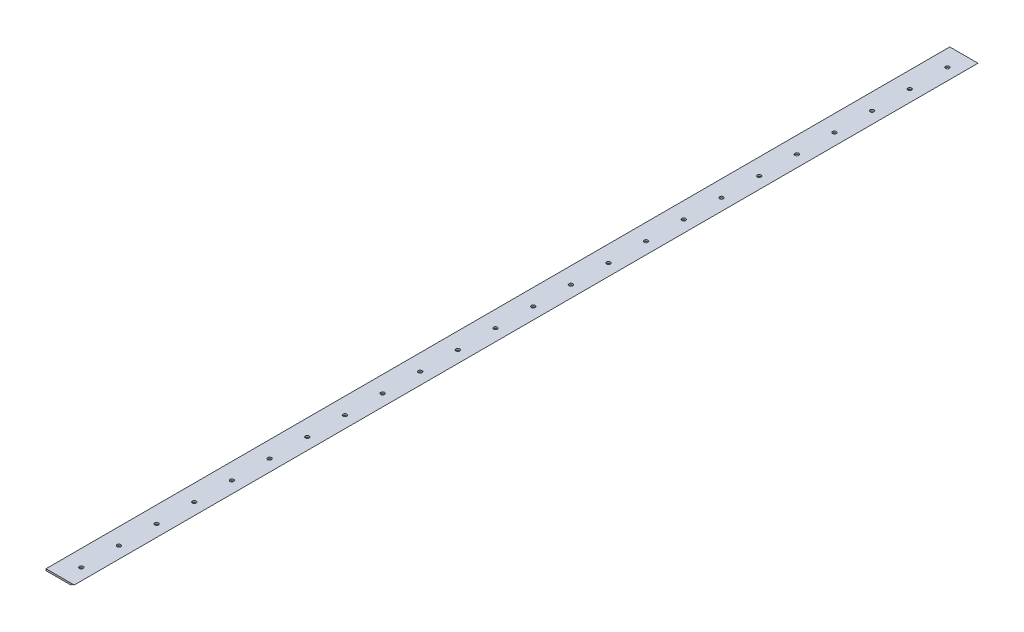
ISO-10303-21;
HEADER;
FILE_DESCRIPTION(('STEP AP214'),'2;1');
FILE_NAME('part.step','',(''),(''),'','','');
FILE_SCHEMA(('AUTOMOTIVE_DESIGN { 1 0 10303 214 1 1 1 1 }'));
ENDSEC;
DATA;
#1=APPLICATION_CONTEXT('core data for automotive mechanical design processes');
#2=APPLICATION_PROTOCOL_DEFINITION('international standard','automotive_design',2000,#1);
#3=PRODUCT_CONTEXT('',#1,'mechanical');
#4=PRODUCT('Part','Part','',(#3));
#5=PRODUCT_RELATED_PRODUCT_CATEGORY('part','',(#4));
#6=PRODUCT_DEFINITION_FORMATION('','',#4);
#7=PRODUCT_DEFINITION_CONTEXT('part definition',#1,'design');
#8=PRODUCT_DEFINITION('design','',#6,#7);
#9=PRODUCT_DEFINITION_SHAPE('','',#8);
#10=(LENGTH_UNIT() NAMED_UNIT(*) SI_UNIT(.MILLI.,.METRE.));
#11=(NAMED_UNIT(*) PLANE_ANGLE_UNIT() SI_UNIT($,.RADIAN.));
#12=(NAMED_UNIT(*) SI_UNIT($,.STERADIAN.) SOLID_ANGLE_UNIT());
#13=UNCERTAINTY_MEASURE_WITH_UNIT(LENGTH_MEASURE(1.E-05),#10,'distance_accuracy_value','');
#14=(GEOMETRIC_REPRESENTATION_CONTEXT(3) GLOBAL_UNCERTAINTY_ASSIGNED_CONTEXT((#13)) GLOBAL_UNIT_ASSIGNED_CONTEXT((#10,
#11,#12)) REPRESENTATION_CONTEXT('',''));
#15=CARTESIAN_POINT('',(0.,0.,0.));
#16=DIRECTION('',(0.,0.,1.));
#17=DIRECTION('',(1.,0.,0.));
#18=AXIS2_PLACEMENT_3D('',#15,#16,#17);
#19=CARTESIAN_POINT('',(0.,5.461,609.6));
#20=DIRECTION('',(0.,0.,-1.));
#21=DIRECTION('',(-1.,0.,0.));
#22=AXIS2_PLACEMENT_3D('',#19,#20,#21);
#23=CYLINDRICAL_SURFACE('',#22,5.461);
#24=CARTESIAN_POINT('',(0.,5.461,-609.6));
#25=DIRECTION('',(0.,0.,1.));
#26=DIRECTION('',(1.,0.,0.));
#27=AXIS2_PLACEMENT_3D('',#24,#25,#26);
#28=CIRCLE('',#27,5.461);
#29=CARTESIAN_POINT('',(0.,10.922,-609.6));
#30=VERTEX_POINT('',#29);
#31=CARTESIAN_POINT('',(-4.44318534387212,8.636,-609.6));
#32=VERTEX_POINT('',#31);
#33=EDGE_CURVE('E103',#30,#32,#28,.T.);
#34=ORIENTED_EDGE('',*,*,#33,.F.);
#35=DIRECTION('',(0.,0.,-1.));
#36=VECTOR('',#35,1.);
#37=CARTESIAN_POINT('',(0.,10.922,609.6));
#38=LINE('',#37,#36);
#39=CARTESIAN_POINT('',(0.,10.922,609.6));
#40=VERTEX_POINT('',#39);
#41=EDGE_CURVE('E74',#40,#30,#38,.T.);
#42=ORIENTED_EDGE('',*,*,#41,.F.);
#43=CARTESIAN_POINT('',(0.,5.461,609.6));
#44=DIRECTION('',(0.,0.,1.));
#45=DIRECTION('',(1.,0.,0.));
#46=AXIS2_PLACEMENT_3D('',#43,#44,#45);
#47=CIRCLE('',#46,5.461);
#48=CARTESIAN_POINT('',(-4.44318534387212,8.636,609.6));
#49=VERTEX_POINT('',#48);
#50=EDGE_CURVE('E85',#40,#49,#47,.T.);
#51=ORIENTED_EDGE('',*,*,#50,.T.);
#52=DIRECTION('',(0.,0.,-1.));
#53=VECTOR('',#52,1.);
#54=CARTESIAN_POINT('',(-4.44318534387212,8.636,609.6));
#55=LINE('',#54,#53);
#56=EDGE_CURVE('E51',#49,#32,#55,.T.);
#57=ORIENTED_EDGE('',*,*,#56,.T.);
#58=EDGE_LOOP('',(#34,#42,#51,#57));
#59=FACE_BOUND('',#58,.T.);
#60=ADVANCED_FACE('F34',(#59),#23,.F.);
#61=CARTESIAN_POINT('',(0.,10.922,609.6));
#62=DIRECTION('',(0.,-1.,0.));
#63=DIRECTION('',(1.,0.,0.));
#64=AXIS2_PLACEMENT_3D('',#61,#62,#63);
#65=PLANE('',#64);
#66=CARTESIAN_POINT('',(-15.875,10.922,533.4));
#67=DIRECTION('',(0.,1.,0.));
#68=DIRECTION('',(0.,0.,1.));
#69=AXIS2_PLACEMENT_3D('',#66,#67,#68);
#70=CIRCLE('',#69,2.55269999999999);
#71=CARTESIAN_POINT('',(-15.875,10.922,535.9527));
#72=VERTEX_POINT('',#71);
#73=EDGE_CURVE('E377',#72,#72,#70,.T.);
#74=ORIENTED_EDGE('',*,*,#73,.F.);
#75=EDGE_LOOP('',(#74));
#76=FACE_BOUND('',#75,.T.);
#77=CARTESIAN_POINT('',(-15.875,10.922,584.2));
#78=DIRECTION('',(0.,1.,0.));
#79=DIRECTION('',(0.,0.,1.));
#80=AXIS2_PLACEMENT_3D('',#77,#78,#79);
#81=CIRCLE('',#80,2.55269999999999);
#82=CARTESIAN_POINT('',(-15.875,10.922,586.7527));
#83=VERTEX_POINT('',#82);
#84=EDGE_CURVE('E378',#83,#83,#81,.T.);
#85=ORIENTED_EDGE('',*,*,#84,.F.);
#86=EDGE_LOOP('',(#85));
#87=FACE_BOUND('',#86,.T.);
#88=DIRECTION('',(-1.,0.,0.));
#89=VECTOR('',#88,1.);
#90=CARTESIAN_POINT('',(0.,10.922,-609.6));
#91=LINE('',#90,#89);
#92=CARTESIAN_POINT('',(-38.1,10.922,-609.6));
#93=VERTEX_POINT('',#92);
#94=EDGE_CURVE('E93',#30,#93,#91,.T.);
#95=ORIENTED_EDGE('',*,*,#94,.T.);
#96=DIRECTION('',(0.,0.,-1.));
#97=VECTOR('',#96,1.);
#98=CARTESIAN_POINT('',(-38.1,10.922,609.6));
#99=LINE('',#98,#97);
#100=CARTESIAN_POINT('',(-38.1,10.922,609.6));
#101=VERTEX_POINT('',#100);
#102=EDGE_CURVE('E89',#101,#93,#99,.T.);
#103=ORIENTED_EDGE('',*,*,#102,.F.);
#104=DIRECTION('',(-1.,0.,0.));
#105=VECTOR('',#104,1.);
#106=CARTESIAN_POINT('',(0.,10.922,609.6));
#107=LINE('',#106,#105);
#108=EDGE_CURVE('E79',#40,#101,#107,.T.);
#109=ORIENTED_EDGE('',*,*,#108,.F.);
#110=ORIENTED_EDGE('',*,*,#41,.T.);
#111=EDGE_LOOP('',(#95,#103,#109,#110));
#112=FACE_BOUND('',#111,.T.);
#113=CARTESIAN_POINT('',(-15.875,10.922,482.6));
#114=DIRECTION('',(0.,1.,0.));
#115=DIRECTION('',(0.,0.,1.));
#116=AXIS2_PLACEMENT_3D('',#113,#114,#115);
#117=CIRCLE('',#116,2.55269999999999);
#118=CARTESIAN_POINT('',(-15.875,10.922,485.1527));
#119=VERTEX_POINT('',#118);
#120=EDGE_CURVE('E118',#119,#119,#117,.T.);
#121=ORIENTED_EDGE('',*,*,#120,.F.);
#122=EDGE_LOOP('',(#121));
#123=FACE_BOUND('',#122,.T.);
#124=CARTESIAN_POINT('',(-15.875,10.922,431.8));
#125=DIRECTION('',(0.,1.,0.));
#126=DIRECTION('',(0.,0.,1.));
#127=AXIS2_PLACEMENT_3D('',#124,#125,#126);
#128=CIRCLE('',#127,2.55269999999999);
#129=CARTESIAN_POINT('',(-15.875,10.922,434.3527));
#130=VERTEX_POINT('',#129);
#131=EDGE_CURVE('E124',#130,#130,#128,.T.);
#132=ORIENTED_EDGE('',*,*,#131,.F.);
#133=EDGE_LOOP('',(#132));
#134=FACE_BOUND('',#133,.T.);
#135=CARTESIAN_POINT('',(-15.875,10.922,381.));
#136=DIRECTION('',(0.,1.,0.));
#137=DIRECTION('',(0.,0.,1.));
#138=AXIS2_PLACEMENT_3D('',#135,#136,#137);
#139=CIRCLE('',#138,2.55269999999999);
#140=CARTESIAN_POINT('',(-15.875,10.922,383.5527));
#141=VERTEX_POINT('',#140);
#142=EDGE_CURVE('E130',#141,#141,#139,.T.);
#143=ORIENTED_EDGE('',*,*,#142,.F.);
#144=EDGE_LOOP('',(#143));
#145=FACE_BOUND('',#144,.T.);
#146=CARTESIAN_POINT('',(-15.875,10.922,330.2));
#147=DIRECTION('',(0.,1.,0.));
#148=DIRECTION('',(0.,0.,1.));
#149=AXIS2_PLACEMENT_3D('',#146,#147,#148);
#150=CIRCLE('',#149,2.55269999999999);
#151=CARTESIAN_POINT('',(-15.875,10.922,332.7527));
#152=VERTEX_POINT('',#151);
#153=EDGE_CURVE('E136',#152,#152,#150,.T.);
#154=ORIENTED_EDGE('',*,*,#153,.F.);
#155=EDGE_LOOP('',(#154));
#156=FACE_BOUND('',#155,.T.);
#157=CARTESIAN_POINT('',(-15.875,10.922,279.4));
#158=DIRECTION('',(0.,1.,0.));
#159=DIRECTION('',(0.,0.,1.));
#160=AXIS2_PLACEMENT_3D('',#157,#158,#159);
#161=CIRCLE('',#160,2.55269999999999);
#162=CARTESIAN_POINT('',(-15.875,10.922,281.9527));
#163=VERTEX_POINT('',#162);
#164=EDGE_CURVE('E142',#163,#163,#161,.T.);
#165=ORIENTED_EDGE('',*,*,#164,.F.);
#166=EDGE_LOOP('',(#165));
#167=FACE_BOUND('',#166,.T.);
#168=CARTESIAN_POINT('',(-15.875,10.922,228.6));
#169=DIRECTION('',(0.,1.,0.));
#170=DIRECTION('',(0.,0.,1.));
#171=AXIS2_PLACEMENT_3D('',#168,#169,#170);
#172=CIRCLE('',#171,2.55269999999999);
#173=CARTESIAN_POINT('',(-15.875,10.922,231.1527));
#174=VERTEX_POINT('',#173);
#175=EDGE_CURVE('E148',#174,#174,#172,.T.);
#176=ORIENTED_EDGE('',*,*,#175,.F.);
#177=EDGE_LOOP('',(#176));
#178=FACE_BOUND('',#177,.T.);
#179=CARTESIAN_POINT('',(-15.875,10.922,177.8));
#180=DIRECTION('',(0.,1.,0.));
#181=DIRECTION('',(0.,0.,1.));
#182=AXIS2_PLACEMENT_3D('',#179,#180,#181);
#183=CIRCLE('',#182,2.55269999999999);
#184=CARTESIAN_POINT('',(-15.875,10.922,180.3527));
#185=VERTEX_POINT('',#184);
#186=EDGE_CURVE('E154',#185,#185,#183,.T.);
#187=ORIENTED_EDGE('',*,*,#186,.F.);
#188=EDGE_LOOP('',(#187));
#189=FACE_BOUND('',#188,.T.);
#190=CARTESIAN_POINT('',(-15.875,10.922,127.));
#191=DIRECTION('',(0.,1.,0.));
#192=DIRECTION('',(0.,0.,1.));
#193=AXIS2_PLACEMENT_3D('',#190,#191,#192);
#194=CIRCLE('',#193,2.55269999999999);
#195=CARTESIAN_POINT('',(-15.875,10.922,129.5527));
#196=VERTEX_POINT('',#195);
#197=EDGE_CURVE('E160',#196,#196,#194,.T.);
#198=ORIENTED_EDGE('',*,*,#197,.F.);
#199=EDGE_LOOP('',(#198));
#200=FACE_BOUND('',#199,.T.);
#201=CARTESIAN_POINT('',(-15.875,10.922,76.2000000000001));
#202=DIRECTION('',(0.,1.,0.));
#203=DIRECTION('',(0.,0.,1.));
#204=AXIS2_PLACEMENT_3D('',#201,#202,#203);
#205=CIRCLE('',#204,2.55269999999999);
#206=CARTESIAN_POINT('',(-15.875,10.922,78.7527000000001));
#207=VERTEX_POINT('',#206);
#208=EDGE_CURVE('E166',#207,#207,#205,.T.);
#209=ORIENTED_EDGE('',*,*,#208,.F.);
#210=EDGE_LOOP('',(#209));
#211=FACE_BOUND('',#210,.T.);
#212=CARTESIAN_POINT('',(-15.875,10.922,25.4000000000001));
#213=DIRECTION('',(0.,1.,0.));
#214=DIRECTION('',(0.,0.,1.));
#215=AXIS2_PLACEMENT_3D('',#212,#213,#214);
#216=CIRCLE('',#215,2.55269999999999);
#217=CARTESIAN_POINT('',(-15.875,10.922,27.9527000000001));
#218=VERTEX_POINT('',#217);
#219=EDGE_CURVE('E172',#218,#218,#216,.T.);
#220=ORIENTED_EDGE('',*,*,#219,.F.);
#221=EDGE_LOOP('',(#220));
#222=FACE_BOUND('',#221,.T.);
#223=CARTESIAN_POINT('',(-15.875,10.922,-25.3999999999999));
#224=DIRECTION('',(0.,1.,0.));
#225=DIRECTION('',(0.,0.,1.));
#226=AXIS2_PLACEMENT_3D('',#223,#224,#225);
#227=CIRCLE('',#226,2.55269999999999);
#228=CARTESIAN_POINT('',(-15.875,10.922,-22.8472999999999));
#229=VERTEX_POINT('',#228);
#230=EDGE_CURVE('E178',#229,#229,#227,.T.);
#231=ORIENTED_EDGE('',*,*,#230,.F.);
#232=EDGE_LOOP('',(#231));
#233=FACE_BOUND('',#232,.T.);
#234=CARTESIAN_POINT('',(-15.875,10.922,-76.1999999999999));
#235=DIRECTION('',(0.,1.,0.));
#236=DIRECTION('',(0.,0.,1.));
#237=AXIS2_PLACEMENT_3D('',#234,#235,#236);
#238=CIRCLE('',#237,2.55269999999999);
#239=CARTESIAN_POINT('',(-15.875,10.922,-73.6472999999999));
#240=VERTEX_POINT('',#239);
#241=EDGE_CURVE('E184',#240,#240,#238,.T.);
#242=ORIENTED_EDGE('',*,*,#241,.F.);
#243=EDGE_LOOP('',(#242));
#244=FACE_BOUND('',#243,.T.);
#245=CARTESIAN_POINT('',(-15.875,10.922,-127.));
#246=DIRECTION('',(0.,1.,0.));
#247=DIRECTION('',(0.,0.,1.));
#248=AXIS2_PLACEMENT_3D('',#245,#246,#247);
#249=CIRCLE('',#248,2.55269999999999);
#250=CARTESIAN_POINT('',(-15.875,10.922,-124.4473));
#251=VERTEX_POINT('',#250);
#252=EDGE_CURVE('E190',#251,#251,#249,.T.);
#253=ORIENTED_EDGE('',*,*,#252,.F.);
#254=EDGE_LOOP('',(#253));
#255=FACE_BOUND('',#254,.T.);
#256=CARTESIAN_POINT('',(-15.875,10.922,-177.8));
#257=DIRECTION('',(0.,1.,0.));
#258=DIRECTION('',(0.,0.,1.));
#259=AXIS2_PLACEMENT_3D('',#256,#257,#258);
#260=CIRCLE('',#259,2.55269999999999);
#261=CARTESIAN_POINT('',(-15.875,10.922,-175.2473));
#262=VERTEX_POINT('',#261);
#263=EDGE_CURVE('E196',#262,#262,#260,.T.);
#264=ORIENTED_EDGE('',*,*,#263,.F.);
#265=EDGE_LOOP('',(#264));
#266=FACE_BOUND('',#265,.T.);
#267=CARTESIAN_POINT('',(-15.875,10.922,-228.6));
#268=DIRECTION('',(0.,1.,0.));
#269=DIRECTION('',(0.,0.,1.));
#270=AXIS2_PLACEMENT_3D('',#267,#268,#269);
#271=CIRCLE('',#270,2.55269999999999);
#272=CARTESIAN_POINT('',(-15.875,10.922,-226.0473));
#273=VERTEX_POINT('',#272);
#274=EDGE_CURVE('E202',#273,#273,#271,.T.);
#275=ORIENTED_EDGE('',*,*,#274,.F.);
#276=EDGE_LOOP('',(#275));
#277=FACE_BOUND('',#276,.T.);
#278=CARTESIAN_POINT('',(-15.875,10.922,-279.4));
#279=DIRECTION('',(0.,1.,0.));
#280=DIRECTION('',(0.,0.,1.));
#281=AXIS2_PLACEMENT_3D('',#278,#279,#280);
#282=CIRCLE('',#281,2.55269999999999);
#283=CARTESIAN_POINT('',(-15.875,10.922,-276.8473));
#284=VERTEX_POINT('',#283);
#285=EDGE_CURVE('E208',#284,#284,#282,.T.);
#286=ORIENTED_EDGE('',*,*,#285,.F.);
#287=EDGE_LOOP('',(#286));
#288=FACE_BOUND('',#287,.T.);
#289=CARTESIAN_POINT('',(-15.875,10.922,-330.2));
#290=DIRECTION('',(0.,1.,0.));
#291=DIRECTION('',(0.,0.,1.));
#292=AXIS2_PLACEMENT_3D('',#289,#290,#291);
#293=CIRCLE('',#292,2.55269999999999);
#294=CARTESIAN_POINT('',(-15.875,10.922,-327.6473));
#295=VERTEX_POINT('',#294);
#296=EDGE_CURVE('E214',#295,#295,#293,.T.);
#297=ORIENTED_EDGE('',*,*,#296,.F.);
#298=EDGE_LOOP('',(#297));
#299=FACE_BOUND('',#298,.T.);
#300=CARTESIAN_POINT('',(-15.875,10.922,-381.));
#301=DIRECTION('',(0.,1.,0.));
#302=DIRECTION('',(0.,0.,1.));
#303=AXIS2_PLACEMENT_3D('',#300,#301,#302);
#304=CIRCLE('',#303,2.55269999999999);
#305=CARTESIAN_POINT('',(-15.875,10.922,-378.4473));
#306=VERTEX_POINT('',#305);
#307=EDGE_CURVE('E220',#306,#306,#304,.T.);
#308=ORIENTED_EDGE('',*,*,#307,.F.);
#309=EDGE_LOOP('',(#308));
#310=FACE_BOUND('',#309,.T.);
#311=CARTESIAN_POINT('',(-15.875,10.922,-431.8));
#312=DIRECTION('',(0.,1.,0.));
#313=DIRECTION('',(0.,0.,1.));
#314=AXIS2_PLACEMENT_3D('',#311,#312,#313);
#315=CIRCLE('',#314,2.55269999999999);
#316=CARTESIAN_POINT('',(-15.875,10.922,-429.2473));
#317=VERTEX_POINT('',#316);
#318=EDGE_CURVE('E226',#317,#317,#315,.T.);
#319=ORIENTED_EDGE('',*,*,#318,.F.);
#320=EDGE_LOOP('',(#319));
#321=FACE_BOUND('',#320,.T.);
#322=CARTESIAN_POINT('',(-15.875,10.922,-482.6));
#323=DIRECTION('',(0.,1.,0.));
#324=DIRECTION('',(0.,0.,1.));
#325=AXIS2_PLACEMENT_3D('',#322,#323,#324);
#326=CIRCLE('',#325,2.55269999999999);
#327=CARTESIAN_POINT('',(-15.875,10.922,-480.0473));
#328=VERTEX_POINT('',#327);
#329=EDGE_CURVE('E232',#328,#328,#326,.T.);
#330=ORIENTED_EDGE('',*,*,#329,.F.);
#331=EDGE_LOOP('',(#330));
#332=FACE_BOUND('',#331,.T.);
#333=CARTESIAN_POINT('',(-15.875,10.922,-533.4));
#334=DIRECTION('',(0.,1.,0.));
#335=DIRECTION('',(0.,0.,1.));
#336=AXIS2_PLACEMENT_3D('',#333,#334,#335);
#337=CIRCLE('',#336,2.55269999999999);
#338=CARTESIAN_POINT('',(-15.875,10.922,-530.8473));
#339=VERTEX_POINT('',#338);
#340=EDGE_CURVE('E238',#339,#339,#337,.T.);
#341=ORIENTED_EDGE('',*,*,#340,.F.);
#342=EDGE_LOOP('',(#341));
#343=FACE_BOUND('',#342,.T.);
#344=CARTESIAN_POINT('',(-15.875,10.922,-584.2));
#345=DIRECTION('',(0.,1.,0.));
#346=DIRECTION('',(0.,0.,1.));
#347=AXIS2_PLACEMENT_3D('',#344,#345,#346);
#348=CIRCLE('',#347,2.55269999999999);
#349=CARTESIAN_POINT('',(-15.875,10.922,-581.6473));
#350=VERTEX_POINT('',#349);
#351=EDGE_CURVE('E11',#350,#350,#348,.T.);
#352=ORIENTED_EDGE('',*,*,#351,.F.);
#353=EDGE_LOOP('',(#352));
#354=FACE_BOUND('',#353,.T.);
#355=ADVANCED_FACE('F90',(#76,#87,#112,#123,#134,#145,#156,#167,#178,#189,#200,#211,#222,#233,
#244,#255,#266,#277,#288,#299,#310,#321,#332,#343,#354),#65,.F.);
#356=CARTESIAN_POINT('',(-38.1,0.,609.6));
#357=DIRECTION('',(1.,0.,0.));
#358=DIRECTION('',(0.,0.,-1.));
#359=AXIS2_PLACEMENT_3D('',#356,#357,#358);
#360=PLANE('',#359);
#361=DIRECTION('',(0.,-1.,0.));
#362=VECTOR('',#361,1.);
#363=CARTESIAN_POINT('',(-38.1,0.,-609.6));
#364=LINE('',#363,#362);
#365=CARTESIAN_POINT('',(-38.1,8.63599999999999,-609.6));
#366=VERTEX_POINT('',#365);
#367=EDGE_CURVE('E107',#93,#366,#364,.T.);
#368=ORIENTED_EDGE('',*,*,#367,.T.);
#369=DIRECTION('',(0.,0.,-1.));
#370=VECTOR('',#369,1.);
#371=CARTESIAN_POINT('',(-38.1,8.63599999999999,609.6));
#372=LINE('',#371,#370);
#373=CARTESIAN_POINT('',(-38.1,8.63599999999999,609.6));
#374=VERTEX_POINT('',#373);
#375=EDGE_CURVE('E66',#374,#366,#372,.T.);
#376=ORIENTED_EDGE('',*,*,#375,.F.);
#377=DIRECTION('',(0.,-1.,0.));
#378=VECTOR('',#377,1.);
#379=CARTESIAN_POINT('',(-38.1,0.,609.6));
#380=LINE('',#379,#378);
#381=EDGE_CURVE('E84',#101,#374,#380,.T.);
#382=ORIENTED_EDGE('',*,*,#381,.F.);
#383=ORIENTED_EDGE('',*,*,#102,.T.);
#384=EDGE_LOOP('',(#368,#376,#382,#383));
#385=FACE_BOUND('',#384,.T.);
#386=ADVANCED_FACE('F97',(#385),#360,.F.);
#387=CARTESIAN_POINT('',(0.,8.636,609.6));
#388=DIRECTION('',(0.,-1.,0.));
#389=DIRECTION('',(1.,0.,0.));
#390=AXIS2_PLACEMENT_3D('',#387,#388,#389);
#391=PLANE('',#390);
#392=CARTESIAN_POINT('',(-15.875,8.636,533.4));
#393=DIRECTION('',(0.,1.,0.));
#394=DIRECTION('',(0.,0.,1.));
#395=AXIS2_PLACEMENT_3D('',#392,#393,#394);
#396=CIRCLE('',#395,2.5527);
#397=CARTESIAN_POINT('',(-15.875,8.636,535.9527));
#398=VERTEX_POINT('',#397);
#399=EDGE_CURVE('E375',#398,#398,#396,.T.);
#400=ORIENTED_EDGE('',*,*,#399,.T.);
#401=EDGE_LOOP('',(#400));
#402=FACE_BOUND('',#401,.T.);
#403=CARTESIAN_POINT('',(-15.875,8.636,584.2));
#404=DIRECTION('',(0.,1.,0.));
#405=DIRECTION('',(0.,0.,1.));
#406=AXIS2_PLACEMENT_3D('',#403,#404,#405);
#407=CIRCLE('',#406,2.5527);
#408=CARTESIAN_POINT('',(-15.875,8.636,586.7527));
#409=VERTEX_POINT('',#408);
#410=EDGE_CURVE('E105',#409,#409,#407,.T.);
#411=ORIENTED_EDGE('',*,*,#410,.T.);
#412=EDGE_LOOP('',(#411));
#413=FACE_BOUND('',#412,.T.);
#414=DIRECTION('',(-1.,0.,0.));
#415=VECTOR('',#414,1.);
#416=CARTESIAN_POINT('',(0.,8.636,-609.6));
#417=LINE('',#416,#415);
#418=EDGE_CURVE('E109',#32,#366,#417,.T.);
#419=ORIENTED_EDGE('',*,*,#418,.F.);
#420=ORIENTED_EDGE('',*,*,#56,.F.);
#421=DIRECTION('',(-1.,0.,0.));
#422=VECTOR('',#421,1.);
#423=CARTESIAN_POINT('',(0.,8.636,609.6));
#424=LINE('',#423,#422);
#425=EDGE_CURVE('E98',#49,#374,#424,.T.);
#426=ORIENTED_EDGE('',*,*,#425,.T.);
#427=ORIENTED_EDGE('',*,*,#375,.T.);
#428=EDGE_LOOP('',(#419,#420,#426,#427));
#429=FACE_BOUND('',#428,.T.);
#430=CARTESIAN_POINT('',(-15.875,8.636,482.6));
#431=DIRECTION('',(0.,1.,0.));
#432=DIRECTION('',(0.,0.,1.));
#433=AXIS2_PLACEMENT_3D('',#430,#431,#432);
#434=CIRCLE('',#433,2.5527);
#435=CARTESIAN_POINT('',(-15.875,8.636,485.1527));
#436=VERTEX_POINT('',#435);
#437=EDGE_CURVE('E115',#436,#436,#434,.T.);
#438=ORIENTED_EDGE('',*,*,#437,.T.);
#439=EDGE_LOOP('',(#438));
#440=FACE_BOUND('',#439,.T.);
#441=CARTESIAN_POINT('',(-15.875,8.636,431.8));
#442=DIRECTION('',(0.,1.,0.));
#443=DIRECTION('',(0.,0.,1.));
#444=AXIS2_PLACEMENT_3D('',#441,#442,#443);
#445=CIRCLE('',#444,2.5527);
#446=CARTESIAN_POINT('',(-15.875,8.636,434.3527));
#447=VERTEX_POINT('',#446);
#448=EDGE_CURVE('E121',#447,#447,#445,.T.);
#449=ORIENTED_EDGE('',*,*,#448,.T.);
#450=EDGE_LOOP('',(#449));
#451=FACE_BOUND('',#450,.T.);
#452=CARTESIAN_POINT('',(-15.875,8.636,381.));
#453=DIRECTION('',(0.,1.,0.));
#454=DIRECTION('',(0.,0.,1.));
#455=AXIS2_PLACEMENT_3D('',#452,#453,#454);
#456=CIRCLE('',#455,2.5527);
#457=CARTESIAN_POINT('',(-15.875,8.636,383.5527));
#458=VERTEX_POINT('',#457);
#459=EDGE_CURVE('E127',#458,#458,#456,.T.);
#460=ORIENTED_EDGE('',*,*,#459,.T.);
#461=EDGE_LOOP('',(#460));
#462=FACE_BOUND('',#461,.T.);
#463=CARTESIAN_POINT('',(-15.875,8.636,330.2));
#464=DIRECTION('',(0.,1.,0.));
#465=DIRECTION('',(0.,0.,1.));
#466=AXIS2_PLACEMENT_3D('',#463,#464,#465);
#467=CIRCLE('',#466,2.5527);
#468=CARTESIAN_POINT('',(-15.875,8.636,332.7527));
#469=VERTEX_POINT('',#468);
#470=EDGE_CURVE('E133',#469,#469,#467,.T.);
#471=ORIENTED_EDGE('',*,*,#470,.T.);
#472=EDGE_LOOP('',(#471));
#473=FACE_BOUND('',#472,.T.);
#474=CARTESIAN_POINT('',(-15.875,8.636,279.4));
#475=DIRECTION('',(0.,1.,0.));
#476=DIRECTION('',(0.,0.,1.));
#477=AXIS2_PLACEMENT_3D('',#474,#475,#476);
#478=CIRCLE('',#477,2.5527);
#479=CARTESIAN_POINT('',(-15.875,8.636,281.9527));
#480=VERTEX_POINT('',#479);
#481=EDGE_CURVE('E139',#480,#480,#478,.T.);
#482=ORIENTED_EDGE('',*,*,#481,.T.);
#483=EDGE_LOOP('',(#482));
#484=FACE_BOUND('',#483,.T.);
#485=CARTESIAN_POINT('',(-15.875,8.636,228.6));
#486=DIRECTION('',(0.,1.,0.));
#487=DIRECTION('',(0.,0.,1.));
#488=AXIS2_PLACEMENT_3D('',#485,#486,#487);
#489=CIRCLE('',#488,2.5527);
#490=CARTESIAN_POINT('',(-15.875,8.636,231.1527));
#491=VERTEX_POINT('',#490);
#492=EDGE_CURVE('E145',#491,#491,#489,.T.);
#493=ORIENTED_EDGE('',*,*,#492,.T.);
#494=EDGE_LOOP('',(#493));
#495=FACE_BOUND('',#494,.T.);
#496=CARTESIAN_POINT('',(-15.875,8.636,177.8));
#497=DIRECTION('',(0.,1.,0.));
#498=DIRECTION('',(0.,0.,1.));
#499=AXIS2_PLACEMENT_3D('',#496,#497,#498);
#500=CIRCLE('',#499,2.5527);
#501=CARTESIAN_POINT('',(-15.875,8.636,180.3527));
#502=VERTEX_POINT('',#501);
#503=EDGE_CURVE('E151',#502,#502,#500,.T.);
#504=ORIENTED_EDGE('',*,*,#503,.T.);
#505=EDGE_LOOP('',(#504));
#506=FACE_BOUND('',#505,.T.);
#507=CARTESIAN_POINT('',(-15.875,8.636,127.));
#508=DIRECTION('',(0.,1.,0.));
#509=DIRECTION('',(0.,0.,1.));
#510=AXIS2_PLACEMENT_3D('',#507,#508,#509);
#511=CIRCLE('',#510,2.5527);
#512=CARTESIAN_POINT('',(-15.875,8.636,129.5527));
#513=VERTEX_POINT('',#512);
#514=EDGE_CURVE('E157',#513,#513,#511,.T.);
#515=ORIENTED_EDGE('',*,*,#514,.T.);
#516=EDGE_LOOP('',(#515));
#517=FACE_BOUND('',#516,.T.);
#518=CARTESIAN_POINT('',(-15.875,8.636,76.2000000000001));
#519=DIRECTION('',(0.,1.,0.));
#520=DIRECTION('',(0.,0.,1.));
#521=AXIS2_PLACEMENT_3D('',#518,#519,#520);
#522=CIRCLE('',#521,2.5527);
#523=CARTESIAN_POINT('',(-15.875,8.636,78.7527000000001));
#524=VERTEX_POINT('',#523);
#525=EDGE_CURVE('E163',#524,#524,#522,.T.);
#526=ORIENTED_EDGE('',*,*,#525,.T.);
#527=EDGE_LOOP('',(#526));
#528=FACE_BOUND('',#527,.T.);
#529=CARTESIAN_POINT('',(-15.875,8.636,25.4000000000001));
#530=DIRECTION('',(0.,1.,0.));
#531=DIRECTION('',(0.,0.,1.));
#532=AXIS2_PLACEMENT_3D('',#529,#530,#531);
#533=CIRCLE('',#532,2.5527);
#534=CARTESIAN_POINT('',(-15.875,8.636,27.9527000000001));
#535=VERTEX_POINT('',#534);
#536=EDGE_CURVE('E169',#535,#535,#533,.T.);
#537=ORIENTED_EDGE('',*,*,#536,.T.);
#538=EDGE_LOOP('',(#537));
#539=FACE_BOUND('',#538,.T.);
#540=CARTESIAN_POINT('',(-15.875,8.636,-25.3999999999999));
#541=DIRECTION('',(0.,1.,0.));
#542=DIRECTION('',(0.,0.,1.));
#543=AXIS2_PLACEMENT_3D('',#540,#541,#542);
#544=CIRCLE('',#543,2.5527);
#545=CARTESIAN_POINT('',(-15.875,8.636,-22.8472999999999));
#546=VERTEX_POINT('',#545);
#547=EDGE_CURVE('E175',#546,#546,#544,.T.);
#548=ORIENTED_EDGE('',*,*,#547,.T.);
#549=EDGE_LOOP('',(#548));
#550=FACE_BOUND('',#549,.T.);
#551=CARTESIAN_POINT('',(-15.875,8.636,-76.1999999999999));
#552=DIRECTION('',(0.,1.,0.));
#553=DIRECTION('',(0.,0.,1.));
#554=AXIS2_PLACEMENT_3D('',#551,#552,#553);
#555=CIRCLE('',#554,2.5527);
#556=CARTESIAN_POINT('',(-15.875,8.636,-73.6472999999999));
#557=VERTEX_POINT('',#556);
#558=EDGE_CURVE('E181',#557,#557,#555,.T.);
#559=ORIENTED_EDGE('',*,*,#558,.T.);
#560=EDGE_LOOP('',(#559));
#561=FACE_BOUND('',#560,.T.);
#562=CARTESIAN_POINT('',(-15.875,8.636,-127.));
#563=DIRECTION('',(0.,1.,0.));
#564=DIRECTION('',(0.,0.,1.));
#565=AXIS2_PLACEMENT_3D('',#562,#563,#564);
#566=CIRCLE('',#565,2.5527);
#567=CARTESIAN_POINT('',(-15.875,8.636,-124.4473));
#568=VERTEX_POINT('',#567);
#569=EDGE_CURVE('E187',#568,#568,#566,.T.);
#570=ORIENTED_EDGE('',*,*,#569,.T.);
#571=EDGE_LOOP('',(#570));
#572=FACE_BOUND('',#571,.T.);
#573=CARTESIAN_POINT('',(-15.875,8.636,-177.8));
#574=DIRECTION('',(0.,1.,0.));
#575=DIRECTION('',(0.,0.,1.));
#576=AXIS2_PLACEMENT_3D('',#573,#574,#575);
#577=CIRCLE('',#576,2.5527);
#578=CARTESIAN_POINT('',(-15.875,8.636,-175.2473));
#579=VERTEX_POINT('',#578);
#580=EDGE_CURVE('E193',#579,#579,#577,.T.);
#581=ORIENTED_EDGE('',*,*,#580,.T.);
#582=EDGE_LOOP('',(#581));
#583=FACE_BOUND('',#582,.T.);
#584=CARTESIAN_POINT('',(-15.875,8.636,-228.6));
#585=DIRECTION('',(0.,1.,0.));
#586=DIRECTION('',(0.,0.,1.));
#587=AXIS2_PLACEMENT_3D('',#584,#585,#586);
#588=CIRCLE('',#587,2.5527);
#589=CARTESIAN_POINT('',(-15.875,8.636,-226.0473));
#590=VERTEX_POINT('',#589);
#591=EDGE_CURVE('E199',#590,#590,#588,.T.);
#592=ORIENTED_EDGE('',*,*,#591,.T.);
#593=EDGE_LOOP('',(#592));
#594=FACE_BOUND('',#593,.T.);
#595=CARTESIAN_POINT('',(-15.875,8.636,-279.4));
#596=DIRECTION('',(0.,1.,0.));
#597=DIRECTION('',(0.,0.,1.));
#598=AXIS2_PLACEMENT_3D('',#595,#596,#597);
#599=CIRCLE('',#598,2.5527);
#600=CARTESIAN_POINT('',(-15.875,8.636,-276.8473));
#601=VERTEX_POINT('',#600);
#602=EDGE_CURVE('E205',#601,#601,#599,.T.);
#603=ORIENTED_EDGE('',*,*,#602,.T.);
#604=EDGE_LOOP('',(#603));
#605=FACE_BOUND('',#604,.T.);
#606=CARTESIAN_POINT('',(-15.875,8.636,-330.2));
#607=DIRECTION('',(0.,1.,0.));
#608=DIRECTION('',(0.,0.,1.));
#609=AXIS2_PLACEMENT_3D('',#606,#607,#608);
#610=CIRCLE('',#609,2.5527);
#611=CARTESIAN_POINT('',(-15.875,8.636,-327.6473));
#612=VERTEX_POINT('',#611);
#613=EDGE_CURVE('E211',#612,#612,#610,.T.);
#614=ORIENTED_EDGE('',*,*,#613,.T.);
#615=EDGE_LOOP('',(#614));
#616=FACE_BOUND('',#615,.T.);
#617=CARTESIAN_POINT('',(-15.875,8.636,-381.));
#618=DIRECTION('',(0.,1.,0.));
#619=DIRECTION('',(0.,0.,1.));
#620=AXIS2_PLACEMENT_3D('',#617,#618,#619);
#621=CIRCLE('',#620,2.5527);
#622=CARTESIAN_POINT('',(-15.875,8.636,-378.4473));
#623=VERTEX_POINT('',#622);
#624=EDGE_CURVE('E217',#623,#623,#621,.T.);
#625=ORIENTED_EDGE('',*,*,#624,.T.);
#626=EDGE_LOOP('',(#625));
#627=FACE_BOUND('',#626,.T.);
#628=CARTESIAN_POINT('',(-15.875,8.636,-431.8));
#629=DIRECTION('',(0.,1.,0.));
#630=DIRECTION('',(0.,0.,1.));
#631=AXIS2_PLACEMENT_3D('',#628,#629,#630);
#632=CIRCLE('',#631,2.5527);
#633=CARTESIAN_POINT('',(-15.875,8.636,-429.2473));
#634=VERTEX_POINT('',#633);
#635=EDGE_CURVE('E223',#634,#634,#632,.T.);
#636=ORIENTED_EDGE('',*,*,#635,.T.);
#637=EDGE_LOOP('',(#636));
#638=FACE_BOUND('',#637,.T.);
#639=CARTESIAN_POINT('',(-15.875,8.636,-482.6));
#640=DIRECTION('',(0.,1.,0.));
#641=DIRECTION('',(0.,0.,1.));
#642=AXIS2_PLACEMENT_3D('',#639,#640,#641);
#643=CIRCLE('',#642,2.5527);
#644=CARTESIAN_POINT('',(-15.875,8.636,-480.0473));
#645=VERTEX_POINT('',#644);
#646=EDGE_CURVE('E229',#645,#645,#643,.T.);
#647=ORIENTED_EDGE('',*,*,#646,.T.);
#648=EDGE_LOOP('',(#647));
#649=FACE_BOUND('',#648,.T.);
#650=CARTESIAN_POINT('',(-15.875,8.636,-533.4));
#651=DIRECTION('',(0.,1.,0.));
#652=DIRECTION('',(0.,0.,1.));
#653=AXIS2_PLACEMENT_3D('',#650,#651,#652);
#654=CIRCLE('',#653,2.5527);
#655=CARTESIAN_POINT('',(-15.875,8.636,-530.8473));
#656=VERTEX_POINT('',#655);
#657=EDGE_CURVE('E235',#656,#656,#654,.T.);
#658=ORIENTED_EDGE('',*,*,#657,.T.);
#659=EDGE_LOOP('',(#658));
#660=FACE_BOUND('',#659,.T.);
#661=CARTESIAN_POINT('',(-15.875,8.636,-584.2));
#662=DIRECTION('',(0.,1.,0.));
#663=DIRECTION('',(0.,0.,1.));
#664=AXIS2_PLACEMENT_3D('',#661,#662,#663);
#665=CIRCLE('',#664,2.5527);
#666=CARTESIAN_POINT('',(-15.875,8.636,-581.6473));
#667=VERTEX_POINT('',#666);
#668=EDGE_CURVE('E43',#667,#667,#665,.T.);
#669=ORIENTED_EDGE('',*,*,#668,.T.);
#670=EDGE_LOOP('',(#669));
#671=FACE_BOUND('',#670,.T.);
#672=ADVANCED_FACE('F243',(#402,#413,#429,#440,#451,#462,#473,#484,#495,#506,#517,#528,#539,
#550,#561,#572,#583,#594,#605,#616,#627,#638,#649,#660,#671),#391,.T.);
#673=CARTESIAN_POINT('',(0.,0.,609.6));
#674=DIRECTION('',(0.,0.,1.));
#675=DIRECTION('',(1.,0.,0.));
#676=AXIS2_PLACEMENT_3D('',#673,#674,#675);
#677=PLANE('',#676);
#678=ORIENTED_EDGE('',*,*,#50,.F.);
#679=ORIENTED_EDGE('',*,*,#108,.T.);
#680=ORIENTED_EDGE('',*,*,#381,.T.);
#681=ORIENTED_EDGE('',*,*,#425,.F.);
#682=EDGE_LOOP('',(#678,#679,#680,#681));
#683=FACE_BOUND('',#682,.T.);
#684=ADVANCED_FACE('F81',(#683),#677,.T.);
#685=CARTESIAN_POINT('',(0.,0.,-609.6));
#686=DIRECTION('',(0.,0.,1.));
#687=DIRECTION('',(1.,0.,0.));
#688=AXIS2_PLACEMENT_3D('',#685,#686,#687);
#689=PLANE('',#688);
#690=ORIENTED_EDGE('',*,*,#33,.T.);
#691=ORIENTED_EDGE('',*,*,#418,.T.);
#692=ORIENTED_EDGE('',*,*,#367,.F.);
#693=ORIENTED_EDGE('',*,*,#94,.F.);
#694=EDGE_LOOP('',(#690,#691,#692,#693));
#695=FACE_BOUND('',#694,.T.);
#696=ADVANCED_FACE('F357',(#695),#689,.F.);
#697=CARTESIAN_POINT('',(-15.875,10.922,584.2));
#698=DIRECTION('',(0.,1.,0.));
#699=DIRECTION('',(0.,0.,1.));
#700=AXIS2_PLACEMENT_3D('',#697,#698,#699);
#701=CYLINDRICAL_SURFACE('',#700,2.55269999999999);
#702=ORIENTED_EDGE('',*,*,#410,.F.);
#703=EDGE_LOOP('',(#702));
#704=FACE_BOUND('',#703,.T.);
#705=ORIENTED_EDGE('',*,*,#84,.T.);
#706=EDGE_LOOP('',(#705));
#707=FACE_BOUND('',#706,.T.);
#708=ADVANCED_FACE('F363',(#704,#707),#701,.F.);
#709=CARTESIAN_POINT('',(-15.875,10.922,533.4));
#710=DIRECTION('',(0.,1.,0.));
#711=DIRECTION('',(0.,0.,1.));
#712=AXIS2_PLACEMENT_3D('',#709,#710,#711);
#713=CYLINDRICAL_SURFACE('',#712,2.55269999999999);
#714=ORIENTED_EDGE('',*,*,#399,.F.);
#715=EDGE_LOOP('',(#714));
#716=FACE_BOUND('',#715,.T.);
#717=ORIENTED_EDGE('',*,*,#73,.T.);
#718=EDGE_LOOP('',(#717));
#719=FACE_BOUND('',#718,.T.);
#720=ADVANCED_FACE('F267',(#716,#719),#713,.F.);
#721=CARTESIAN_POINT('',(-15.875,10.922,482.6));
#722=DIRECTION('',(0.,1.,0.));
#723=DIRECTION('',(0.,0.,1.));
#724=AXIS2_PLACEMENT_3D('',#721,#722,#723);
#725=CYLINDRICAL_SURFACE('',#724,2.55269999999999);
#726=ORIENTED_EDGE('',*,*,#437,.F.);
#727=EDGE_LOOP('',(#726));
#728=FACE_BOUND('',#727,.T.);
#729=ORIENTED_EDGE('',*,*,#120,.T.);
#730=EDGE_LOOP('',(#729));
#731=FACE_BOUND('',#730,.T.);
#732=ADVANCED_FACE('F263',(#728,#731),#725,.F.);
#733=CARTESIAN_POINT('',(-15.875,10.922,431.8));
#734=DIRECTION('',(0.,1.,0.));
#735=DIRECTION('',(0.,0.,1.));
#736=AXIS2_PLACEMENT_3D('',#733,#734,#735);
#737=CYLINDRICAL_SURFACE('',#736,2.55269999999999);
#738=ORIENTED_EDGE('',*,*,#448,.F.);
#739=EDGE_LOOP('',(#738));
#740=FACE_BOUND('',#739,.T.);
#741=ORIENTED_EDGE('',*,*,#131,.T.);
#742=EDGE_LOOP('',(#741));
#743=FACE_BOUND('',#742,.T.);
#744=ADVANCED_FACE('F266',(#740,#743),#737,.F.);
#745=CARTESIAN_POINT('',(-15.875,10.922,381.));
#746=DIRECTION('',(0.,1.,0.));
#747=DIRECTION('',(0.,0.,1.));
#748=AXIS2_PLACEMENT_3D('',#745,#746,#747);
#749=CYLINDRICAL_SURFACE('',#748,2.55269999999999);
#750=ORIENTED_EDGE('',*,*,#459,.F.);
#751=EDGE_LOOP('',(#750));
#752=FACE_BOUND('',#751,.T.);
#753=ORIENTED_EDGE('',*,*,#142,.T.);
#754=EDGE_LOOP('',(#753));
#755=FACE_BOUND('',#754,.T.);
#756=ADVANCED_FACE('F271',(#752,#755),#749,.F.);
#757=CARTESIAN_POINT('',(-15.875,10.922,330.2));
#758=DIRECTION('',(0.,1.,0.));
#759=DIRECTION('',(0.,0.,1.));
#760=AXIS2_PLACEMENT_3D('',#757,#758,#759);
#761=CYLINDRICAL_SURFACE('',#760,2.55269999999999);
#762=ORIENTED_EDGE('',*,*,#470,.F.);
#763=EDGE_LOOP('',(#762));
#764=FACE_BOUND('',#763,.T.);
#765=ORIENTED_EDGE('',*,*,#153,.T.);
#766=EDGE_LOOP('',(#765));
#767=FACE_BOUND('',#766,.T.);
#768=ADVANCED_FACE('F275',(#764,#767),#761,.F.);
#769=CARTESIAN_POINT('',(-15.875,10.922,279.4));
#770=DIRECTION('',(0.,1.,0.));
#771=DIRECTION('',(0.,0.,1.));
#772=AXIS2_PLACEMENT_3D('',#769,#770,#771);
#773=CYLINDRICAL_SURFACE('',#772,2.55269999999999);
#774=ORIENTED_EDGE('',*,*,#481,.F.);
#775=EDGE_LOOP('',(#774));
#776=FACE_BOUND('',#775,.T.);
#777=ORIENTED_EDGE('',*,*,#164,.T.);
#778=EDGE_LOOP('',(#777));
#779=FACE_BOUND('',#778,.T.);
#780=ADVANCED_FACE('F279',(#776,#779),#773,.F.);
#781=CARTESIAN_POINT('',(-15.875,10.922,228.6));
#782=DIRECTION('',(0.,1.,0.));
#783=DIRECTION('',(0.,0.,1.));
#784=AXIS2_PLACEMENT_3D('',#781,#782,#783);
#785=CYLINDRICAL_SURFACE('',#784,2.55269999999999);
#786=ORIENTED_EDGE('',*,*,#492,.F.);
#787=EDGE_LOOP('',(#786));
#788=FACE_BOUND('',#787,.T.);
#789=ORIENTED_EDGE('',*,*,#175,.T.);
#790=EDGE_LOOP('',(#789));
#791=FACE_BOUND('',#790,.T.);
#792=ADVANCED_FACE('F283',(#788,#791),#785,.F.);
#793=CARTESIAN_POINT('',(-15.875,10.922,177.8));
#794=DIRECTION('',(0.,1.,0.));
#795=DIRECTION('',(0.,0.,1.));
#796=AXIS2_PLACEMENT_3D('',#793,#794,#795);
#797=CYLINDRICAL_SURFACE('',#796,2.55269999999999);
#798=ORIENTED_EDGE('',*,*,#503,.F.);
#799=EDGE_LOOP('',(#798));
#800=FACE_BOUND('',#799,.T.);
#801=ORIENTED_EDGE('',*,*,#186,.T.);
#802=EDGE_LOOP('',(#801));
#803=FACE_BOUND('',#802,.T.);
#804=ADVANCED_FACE('F287',(#800,#803),#797,.F.);
#805=CARTESIAN_POINT('',(-15.875,10.922,127.));
#806=DIRECTION('',(0.,1.,0.));
#807=DIRECTION('',(0.,0.,1.));
#808=AXIS2_PLACEMENT_3D('',#805,#806,#807);
#809=CYLINDRICAL_SURFACE('',#808,2.55269999999999);
#810=ORIENTED_EDGE('',*,*,#514,.F.);
#811=EDGE_LOOP('',(#810));
#812=FACE_BOUND('',#811,.T.);
#813=ORIENTED_EDGE('',*,*,#197,.T.);
#814=EDGE_LOOP('',(#813));
#815=FACE_BOUND('',#814,.T.);
#816=ADVANCED_FACE('F291',(#812,#815),#809,.F.);
#817=CARTESIAN_POINT('',(-15.875,10.922,76.2000000000001));
#818=DIRECTION('',(0.,1.,0.));
#819=DIRECTION('',(0.,0.,1.));
#820=AXIS2_PLACEMENT_3D('',#817,#818,#819);
#821=CYLINDRICAL_SURFACE('',#820,2.55269999999999);
#822=ORIENTED_EDGE('',*,*,#525,.F.);
#823=EDGE_LOOP('',(#822));
#824=FACE_BOUND('',#823,.T.);
#825=ORIENTED_EDGE('',*,*,#208,.T.);
#826=EDGE_LOOP('',(#825));
#827=FACE_BOUND('',#826,.T.);
#828=ADVANCED_FACE('F295',(#824,#827),#821,.F.);
#829=CARTESIAN_POINT('',(-15.875,10.922,25.4000000000001));
#830=DIRECTION('',(0.,1.,0.));
#831=DIRECTION('',(0.,0.,1.));
#832=AXIS2_PLACEMENT_3D('',#829,#830,#831);
#833=CYLINDRICAL_SURFACE('',#832,2.55269999999999);
#834=ORIENTED_EDGE('',*,*,#536,.F.);
#835=EDGE_LOOP('',(#834));
#836=FACE_BOUND('',#835,.T.);
#837=ORIENTED_EDGE('',*,*,#219,.T.);
#838=EDGE_LOOP('',(#837));
#839=FACE_BOUND('',#838,.T.);
#840=ADVANCED_FACE('F299',(#836,#839),#833,.F.);
#841=CARTESIAN_POINT('',(-15.875,10.922,-25.3999999999999));
#842=DIRECTION('',(0.,1.,0.));
#843=DIRECTION('',(0.,0.,1.));
#844=AXIS2_PLACEMENT_3D('',#841,#842,#843);
#845=CYLINDRICAL_SURFACE('',#844,2.55269999999999);
#846=ORIENTED_EDGE('',*,*,#547,.F.);
#847=EDGE_LOOP('',(#846));
#848=FACE_BOUND('',#847,.T.);
#849=ORIENTED_EDGE('',*,*,#230,.T.);
#850=EDGE_LOOP('',(#849));
#851=FACE_BOUND('',#850,.T.);
#852=ADVANCED_FACE('F303',(#848,#851),#845,.F.);
#853=CARTESIAN_POINT('',(-15.875,10.922,-76.1999999999999));
#854=DIRECTION('',(0.,1.,0.));
#855=DIRECTION('',(0.,0.,1.));
#856=AXIS2_PLACEMENT_3D('',#853,#854,#855);
#857=CYLINDRICAL_SURFACE('',#856,2.55269999999999);
#858=ORIENTED_EDGE('',*,*,#558,.F.);
#859=EDGE_LOOP('',(#858));
#860=FACE_BOUND('',#859,.T.);
#861=ORIENTED_EDGE('',*,*,#241,.T.);
#862=EDGE_LOOP('',(#861));
#863=FACE_BOUND('',#862,.T.);
#864=ADVANCED_FACE('F307',(#860,#863),#857,.F.);
#865=CARTESIAN_POINT('',(-15.875,10.922,-127.));
#866=DIRECTION('',(0.,1.,0.));
#867=DIRECTION('',(0.,0.,1.));
#868=AXIS2_PLACEMENT_3D('',#865,#866,#867);
#869=CYLINDRICAL_SURFACE('',#868,2.55269999999999);
#870=ORIENTED_EDGE('',*,*,#569,.F.);
#871=EDGE_LOOP('',(#870));
#872=FACE_BOUND('',#871,.T.);
#873=ORIENTED_EDGE('',*,*,#252,.T.);
#874=EDGE_LOOP('',(#873));
#875=FACE_BOUND('',#874,.T.);
#876=ADVANCED_FACE('F311',(#872,#875),#869,.F.);
#877=CARTESIAN_POINT('',(-15.875,10.922,-177.8));
#878=DIRECTION('',(0.,1.,0.));
#879=DIRECTION('',(0.,0.,1.));
#880=AXIS2_PLACEMENT_3D('',#877,#878,#879);
#881=CYLINDRICAL_SURFACE('',#880,2.55269999999999);
#882=ORIENTED_EDGE('',*,*,#580,.F.);
#883=EDGE_LOOP('',(#882));
#884=FACE_BOUND('',#883,.T.);
#885=ORIENTED_EDGE('',*,*,#263,.T.);
#886=EDGE_LOOP('',(#885));
#887=FACE_BOUND('',#886,.T.);
#888=ADVANCED_FACE('F315',(#884,#887),#881,.F.);
#889=CARTESIAN_POINT('',(-15.875,10.922,-228.6));
#890=DIRECTION('',(0.,1.,0.));
#891=DIRECTION('',(0.,0.,1.));
#892=AXIS2_PLACEMENT_3D('',#889,#890,#891);
#893=CYLINDRICAL_SURFACE('',#892,2.55269999999999);
#894=ORIENTED_EDGE('',*,*,#591,.F.);
#895=EDGE_LOOP('',(#894));
#896=FACE_BOUND('',#895,.T.);
#897=ORIENTED_EDGE('',*,*,#274,.T.);
#898=EDGE_LOOP('',(#897));
#899=FACE_BOUND('',#898,.T.);
#900=ADVANCED_FACE('F319',(#896,#899),#893,.F.);
#901=CARTESIAN_POINT('',(-15.875,10.922,-279.4));
#902=DIRECTION('',(0.,1.,0.));
#903=DIRECTION('',(0.,0.,1.));
#904=AXIS2_PLACEMENT_3D('',#901,#902,#903);
#905=CYLINDRICAL_SURFACE('',#904,2.55269999999999);
#906=ORIENTED_EDGE('',*,*,#602,.F.);
#907=EDGE_LOOP('',(#906));
#908=FACE_BOUND('',#907,.T.);
#909=ORIENTED_EDGE('',*,*,#285,.T.);
#910=EDGE_LOOP('',(#909));
#911=FACE_BOUND('',#910,.T.);
#912=ADVANCED_FACE('F323',(#908,#911),#905,.F.);
#913=CARTESIAN_POINT('',(-15.875,10.922,-330.2));
#914=DIRECTION('',(0.,1.,0.));
#915=DIRECTION('',(0.,0.,1.));
#916=AXIS2_PLACEMENT_3D('',#913,#914,#915);
#917=CYLINDRICAL_SURFACE('',#916,2.55269999999999);
#918=ORIENTED_EDGE('',*,*,#613,.F.);
#919=EDGE_LOOP('',(#918));
#920=FACE_BOUND('',#919,.T.);
#921=ORIENTED_EDGE('',*,*,#296,.T.);
#922=EDGE_LOOP('',(#921));
#923=FACE_BOUND('',#922,.T.);
#924=ADVANCED_FACE('F327',(#920,#923),#917,.F.);
#925=CARTESIAN_POINT('',(-15.875,10.922,-381.));
#926=DIRECTION('',(0.,1.,0.));
#927=DIRECTION('',(0.,0.,1.));
#928=AXIS2_PLACEMENT_3D('',#925,#926,#927);
#929=CYLINDRICAL_SURFACE('',#928,2.55269999999999);
#930=ORIENTED_EDGE('',*,*,#624,.F.);
#931=EDGE_LOOP('',(#930));
#932=FACE_BOUND('',#931,.T.);
#933=ORIENTED_EDGE('',*,*,#307,.T.);
#934=EDGE_LOOP('',(#933));
#935=FACE_BOUND('',#934,.T.);
#936=ADVANCED_FACE('F331',(#932,#935),#929,.F.);
#937=CARTESIAN_POINT('',(-15.875,10.922,-431.8));
#938=DIRECTION('',(0.,1.,0.));
#939=DIRECTION('',(0.,0.,1.));
#940=AXIS2_PLACEMENT_3D('',#937,#938,#939);
#941=CYLINDRICAL_SURFACE('',#940,2.55269999999999);
#942=ORIENTED_EDGE('',*,*,#635,.F.);
#943=EDGE_LOOP('',(#942));
#944=FACE_BOUND('',#943,.T.);
#945=ORIENTED_EDGE('',*,*,#318,.T.);
#946=EDGE_LOOP('',(#945));
#947=FACE_BOUND('',#946,.T.);
#948=ADVANCED_FACE('F335',(#944,#947),#941,.F.);
#949=CARTESIAN_POINT('',(-15.875,10.922,-482.6));
#950=DIRECTION('',(0.,1.,0.));
#951=DIRECTION('',(0.,0.,1.));
#952=AXIS2_PLACEMENT_3D('',#949,#950,#951);
#953=CYLINDRICAL_SURFACE('',#952,2.55269999999999);
#954=ORIENTED_EDGE('',*,*,#646,.F.);
#955=EDGE_LOOP('',(#954));
#956=FACE_BOUND('',#955,.T.);
#957=ORIENTED_EDGE('',*,*,#329,.T.);
#958=EDGE_LOOP('',(#957));
#959=FACE_BOUND('',#958,.T.);
#960=ADVANCED_FACE('F339',(#956,#959),#953,.F.);
#961=CARTESIAN_POINT('',(-15.875,10.922,-533.4));
#962=DIRECTION('',(0.,1.,0.));
#963=DIRECTION('',(0.,0.,1.));
#964=AXIS2_PLACEMENT_3D('',#961,#962,#963);
#965=CYLINDRICAL_SURFACE('',#964,2.55269999999999);
#966=ORIENTED_EDGE('',*,*,#657,.F.);
#967=EDGE_LOOP('',(#966));
#968=FACE_BOUND('',#967,.T.);
#969=ORIENTED_EDGE('',*,*,#340,.T.);
#970=EDGE_LOOP('',(#969));
#971=FACE_BOUND('',#970,.T.);
#972=ADVANCED_FACE('F247',(#968,#971),#965,.F.);
#973=CARTESIAN_POINT('',(-15.875,10.922,-584.2));
#974=DIRECTION('',(0.,1.,0.));
#975=DIRECTION('',(0.,0.,1.));
#976=AXIS2_PLACEMENT_3D('',#973,#974,#975);
#977=CYLINDRICAL_SURFACE('',#976,2.55269999999999);
#978=ORIENTED_EDGE('',*,*,#668,.F.);
#979=EDGE_LOOP('',(#978));
#980=FACE_BOUND('',#979,.T.);
#981=ORIENTED_EDGE('',*,*,#351,.T.);
#982=EDGE_LOOP('',(#981));
#983=FACE_BOUND('',#982,.T.);
#984=ADVANCED_FACE('F36',(#980,#983),#977,.F.);
#985=CLOSED_SHELL('',(#60,#355,#386,#672,#684,#696,#708,#720,#732,#744,#756,#768,#780,#792,#804,
#816,#828,#840,#852,#864,#876,#888,#900,#912,#924,#936,#948,#960,#972,#984));
#986=MANIFOLD_SOLID_BREP('B2',#985);
#987=ADVANCED_BREP_SHAPE_REPRESENTATION('',(#18,#986),#14);
#988=SHAPE_DEFINITION_REPRESENTATION(#9,#987);
ENDSEC;
END-ISO-10303-21;
